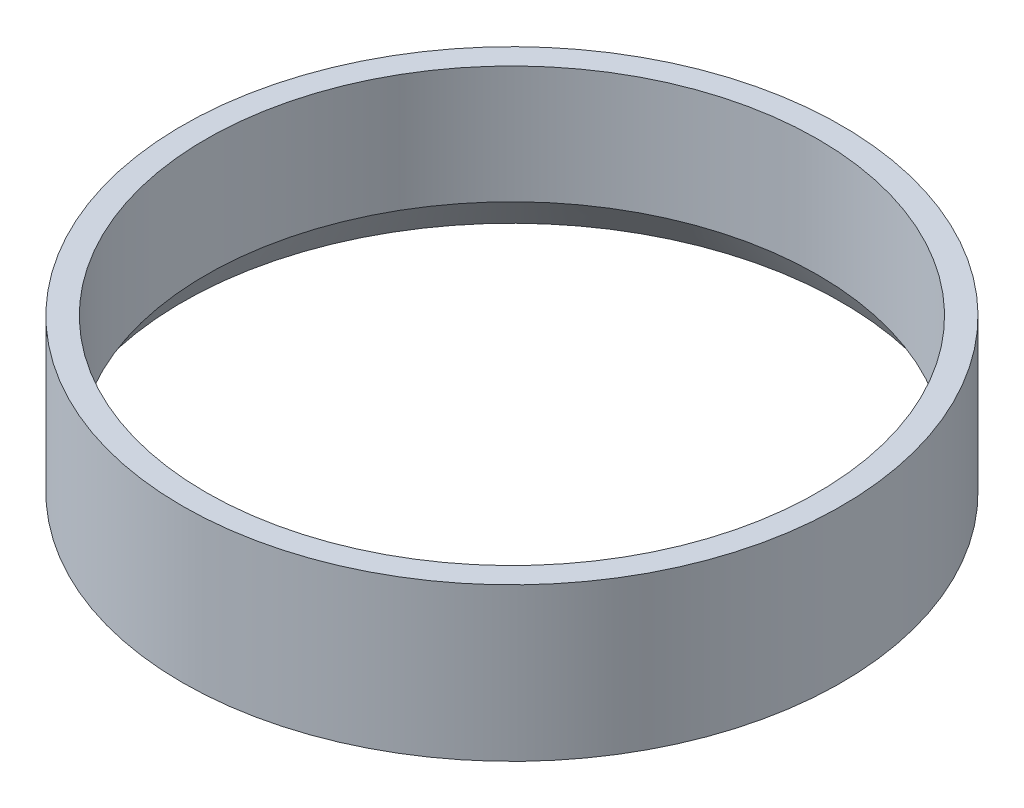
ISO-10303-21;
HEADER;
FILE_DESCRIPTION(('STEP AP214'),'2;1');
FILE_NAME('part.step','',(''),(''),'','','');
FILE_SCHEMA(('AUTOMOTIVE_DESIGN { 1 0 10303 214 1 1 1 1 }'));
ENDSEC;
DATA;
#1=APPLICATION_CONTEXT('core data for automotive mechanical design processes');
#2=APPLICATION_PROTOCOL_DEFINITION('international standard','automotive_design',2000,#1);
#3=PRODUCT_CONTEXT('',#1,'mechanical');
#4=PRODUCT('Part','Part','',(#3));
#5=PRODUCT_RELATED_PRODUCT_CATEGORY('part','',(#4));
#6=PRODUCT_DEFINITION_FORMATION('','',#4);
#7=PRODUCT_DEFINITION_CONTEXT('part definition',#1,'design');
#8=PRODUCT_DEFINITION('design','',#6,#7);
#9=PRODUCT_DEFINITION_SHAPE('','',#8);
#10=(LENGTH_UNIT() NAMED_UNIT(*) SI_UNIT(.MILLI.,.METRE.));
#11=(NAMED_UNIT(*) PLANE_ANGLE_UNIT() SI_UNIT($,.RADIAN.));
#12=(NAMED_UNIT(*) SI_UNIT($,.STERADIAN.) SOLID_ANGLE_UNIT());
#13=UNCERTAINTY_MEASURE_WITH_UNIT(LENGTH_MEASURE(1.E-05),#10,'distance_accuracy_value','');
#14=(GEOMETRIC_REPRESENTATION_CONTEXT(3) GLOBAL_UNCERTAINTY_ASSIGNED_CONTEXT((#13)) GLOBAL_UNIT_ASSIGNED_CONTEXT((#10,
#11,#12)) REPRESENTATION_CONTEXT('',''));
#15=CARTESIAN_POINT('',(0.,0.,0.));
#16=DIRECTION('',(0.,0.,1.));
#17=DIRECTION('',(1.,0.,0.));
#18=AXIS2_PLACEMENT_3D('',#15,#16,#17);
#19=CARTESIAN_POINT('',(26.,10.,0.));
#20=DIRECTION('',(0.,-1.,0.));
#21=DIRECTION('',(0.,0.,-1.));
#22=AXIS2_PLACEMENT_3D('',#19,#20,#21);
#23=PLANE('',#22);
#24=CARTESIAN_POINT('',(0.,10.,0.));
#25=DIRECTION('',(0.,1.,0.));
#26=DIRECTION('',(0.,0.,1.));
#27=AXIS2_PLACEMENT_3D('',#24,#25,#26);
#28=CIRCLE('',#27,26.);
#29=CARTESIAN_POINT('',(0.,10.,26.));
#30=VERTEX_POINT('',#29);
#31=EDGE_CURVE('E10',#30,#30,#28,.T.);
#32=ORIENTED_EDGE('',*,*,#31,.F.);
#33=EDGE_LOOP('',(#32));
#34=FACE_BOUND('',#33,.T.);
#35=CARTESIAN_POINT('',(0.,10.,0.));
#36=DIRECTION('',(0.,1.,0.));
#37=DIRECTION('',(0.,0.,1.));
#38=AXIS2_PLACEMENT_3D('',#35,#36,#37);
#39=CIRCLE('',#38,28.0083205029434);
#40=CARTESIAN_POINT('',(0.,10.,28.0083205029434));
#41=VERTEX_POINT('',#40);
#42=EDGE_CURVE('E54',#41,#41,#39,.T.);
#43=ORIENTED_EDGE('',*,*,#42,.T.);
#44=EDGE_LOOP('',(#43));
#45=FACE_BOUND('',#44,.T.);
#46=ADVANCED_FACE('F35',(#34,#45),#23,.F.);
#47=CARTESIAN_POINT('',(0.,10.,0.));
#48=DIRECTION('',(0.,1.,0.));
#49=DIRECTION('',(0.,0.,1.));
#50=AXIS2_PLACEMENT_3D('',#47,#48,#49);
#51=CYLINDRICAL_SURFACE('',#50,26.);
#52=CARTESIAN_POINT('',(0.,0.00554700196225139,0.));
#53=DIRECTION('',(0.,1.,0.));
#54=DIRECTION('',(0.,0.,1.));
#55=AXIS2_PLACEMENT_3D('',#52,#53,#54);
#56=CIRCLE('',#55,26.);
#57=CARTESIAN_POINT('',(0.,0.00554700196225139,26.));
#58=VERTEX_POINT('',#57);
#59=EDGE_CURVE('E41',#58,#58,#56,.T.);
#60=ORIENTED_EDGE('',*,*,#59,.F.);
#61=EDGE_LOOP('',(#60));
#62=FACE_BOUND('',#61,.T.);
#63=ORIENTED_EDGE('',*,*,#31,.T.);
#64=EDGE_LOOP('',(#63));
#65=FACE_BOUND('',#64,.T.);
#66=ADVANCED_FACE('F73',(#62,#65),#51,.F.);
#67=CARTESIAN_POINT('',(26.0083205029434,0.00554700196225225,0.));
#68=DIRECTION('',(0.,1.,0.));
#69=DIRECTION('',(0.,0.,1.));
#70=AXIS2_PLACEMENT_3D('',#67,#68,#69);
#71=PLANE('',#70);
#72=CARTESIAN_POINT('',(0.,0.00554700196225312,0.));
#73=DIRECTION('',(0.,1.,0.));
#74=DIRECTION('',(0.,0.,1.));
#75=AXIS2_PLACEMENT_3D('',#72,#73,#74);
#76=CIRCLE('',#75,26.0083205029434);
#77=CARTESIAN_POINT('',(0.,0.00554700196225312,26.0083205029434));
#78=VERTEX_POINT('',#77);
#79=EDGE_CURVE('E45',#78,#78,#76,.T.);
#80=ORIENTED_EDGE('',*,*,#79,.F.);
#81=EDGE_LOOP('',(#80));
#82=FACE_BOUND('',#81,.T.);
#83=ORIENTED_EDGE('',*,*,#59,.T.);
#84=EDGE_LOOP('',(#83));
#85=FACE_BOUND('',#84,.T.);
#86=ADVANCED_FACE('F68',(#82,#85),#71,.F.);
#87=CARTESIAN_POINT('',(0.,0.00554700196225312,0.));
#88=DIRECTION('',(0.,-1.,0.));
#89=DIRECTION('',(0.,0.,-1.));
#90=AXIS2_PLACEMENT_3D('',#87,#88,#89);
#91=CONICAL_SURFACE('',#90,26.0083205029434,0.588002603547568);
#92=CARTESIAN_POINT('',(0.,-2.99445299803775,0.));
#93=DIRECTION('',(0.,1.,0.));
#94=DIRECTION('',(0.,0.,1.));
#95=AXIS2_PLACEMENT_3D('',#92,#93,#94);
#96=CIRCLE('',#95,28.0083205029434);
#97=CARTESIAN_POINT('',(0.,-2.99445299803775,28.0083205029434));
#98=VERTEX_POINT('',#97);
#99=EDGE_CURVE('E49',#98,#98,#96,.T.);
#100=ORIENTED_EDGE('',*,*,#99,.F.);
#101=EDGE_LOOP('',(#100));
#102=FACE_BOUND('',#101,.T.);
#103=ORIENTED_EDGE('',*,*,#79,.T.);
#104=EDGE_LOOP('',(#103));
#105=FACE_BOUND('',#104,.T.);
#106=ADVANCED_FACE('F62',(#102,#105),#91,.F.);
#107=CARTESIAN_POINT('',(0.,10.,0.));
#108=DIRECTION('',(0.,1.,0.));
#109=DIRECTION('',(0.,0.,1.));
#110=AXIS2_PLACEMENT_3D('',#107,#108,#109);
#111=CYLINDRICAL_SURFACE('',#110,28.0083205029434);
#112=ORIENTED_EDGE('',*,*,#42,.F.);
#113=EDGE_LOOP('',(#112));
#114=FACE_BOUND('',#113,.T.);
#115=ORIENTED_EDGE('',*,*,#99,.T.);
#116=EDGE_LOOP('',(#115));
#117=FACE_BOUND('',#116,.T.);
#118=ADVANCED_FACE('F59',(#114,#117),#111,.T.);
#119=CLOSED_SHELL('',(#46,#66,#86,#106,#118));
#120=MANIFOLD_SOLID_BREP('B2',#119);
#121=ADVANCED_BREP_SHAPE_REPRESENTATION('',(#18,#120),#14);
#122=SHAPE_DEFINITION_REPRESENTATION(#9,#121);
ENDSEC;
END-ISO-10303-21;
